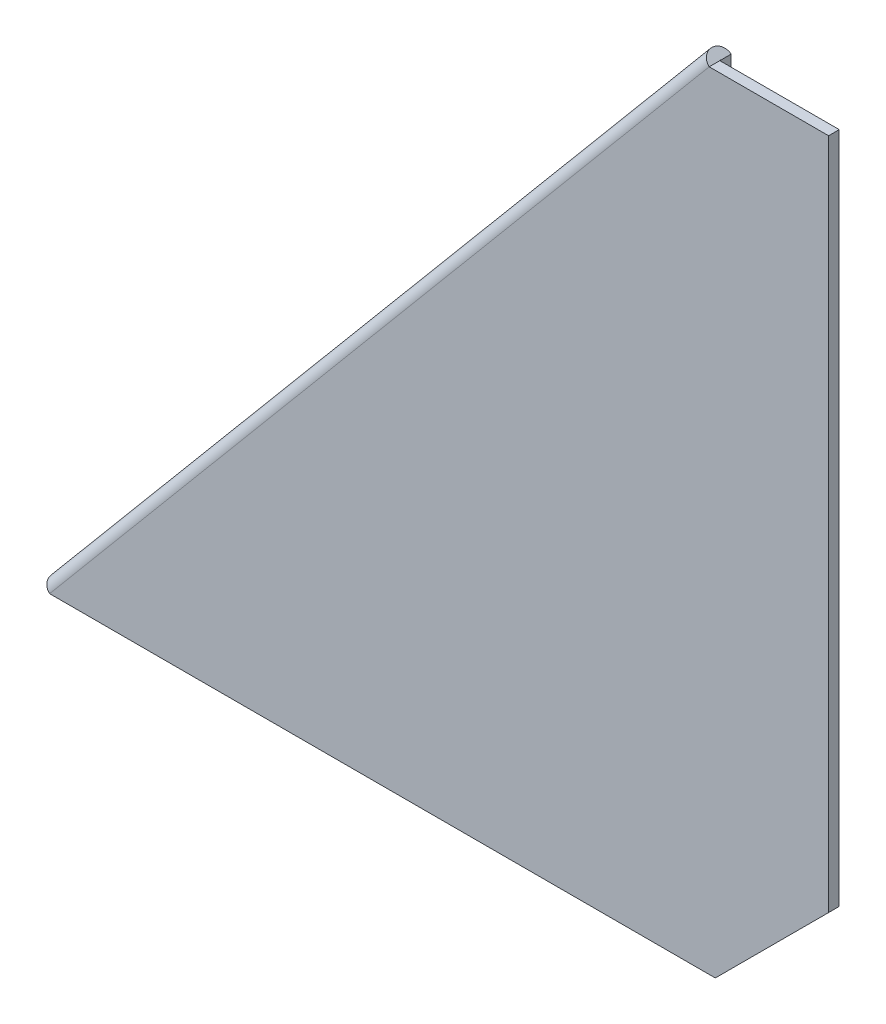
ISO-10303-21;
HEADER;
FILE_DESCRIPTION(('STEP AP214'),'2;1');
FILE_NAME('part.step','',(''),(''),'','','');
FILE_SCHEMA(('AUTOMOTIVE_DESIGN { 1 0 10303 214 1 1 1 1 }'));
ENDSEC;
DATA;
#1=APPLICATION_CONTEXT('core data for automotive mechanical design processes');
#2=APPLICATION_PROTOCOL_DEFINITION('international standard','automotive_design',2000,#1);
#3=PRODUCT_CONTEXT('',#1,'mechanical');
#4=PRODUCT('Part','Part','',(#3));
#5=PRODUCT_RELATED_PRODUCT_CATEGORY('part','',(#4));
#6=PRODUCT_DEFINITION_FORMATION('','',#4);
#7=PRODUCT_DEFINITION_CONTEXT('part definition',#1,'design');
#8=PRODUCT_DEFINITION('design','',#6,#7);
#9=PRODUCT_DEFINITION_SHAPE('','',#8);
#10=(LENGTH_UNIT() NAMED_UNIT(*) SI_UNIT(.MILLI.,.METRE.));
#11=(NAMED_UNIT(*) PLANE_ANGLE_UNIT() SI_UNIT($,.RADIAN.));
#12=(NAMED_UNIT(*) SI_UNIT($,.STERADIAN.) SOLID_ANGLE_UNIT());
#13=UNCERTAINTY_MEASURE_WITH_UNIT(LENGTH_MEASURE(1.E-05),#10,'distance_accuracy_value','');
#14=(GEOMETRIC_REPRESENTATION_CONTEXT(3) GLOBAL_UNCERTAINTY_ASSIGNED_CONTEXT((#13)) GLOBAL_UNIT_ASSIGNED_CONTEXT((#10,
#11,#12)) REPRESENTATION_CONTEXT('',''));
#15=CARTESIAN_POINT('',(0.,0.,0.));
#16=DIRECTION('',(0.,0.,1.));
#17=DIRECTION('',(1.,0.,0.));
#18=AXIS2_PLACEMENT_3D('',#15,#16,#17);
#19=CARTESIAN_POINT('',(0.,0.,1.5));
#20=DIRECTION('',(0.,-1.,0.));
#21=DIRECTION('',(0.,0.,1.));
#22=AXIS2_PLACEMENT_3D('',#19,#20,#21);
#23=PLANE('',#22);
#24=DIRECTION('',(1.,0.,0.));
#25=VECTOR('',#24,1.);
#26=CARTESIAN_POINT('',(0.,0.,1.5));
#27=LINE('',#26,#25);
#28=CARTESIAN_POINT('',(-110.,0.,1.5));
#29=VERTEX_POINT('',#28);
#30=CARTESIAN_POINT('',(-100.274715694475,0.,1.5));
#31=VERTEX_POINT('',#30);
#32=EDGE_CURVE('E180',#29,#31,#27,.T.);
#33=ORIENTED_EDGE('',*,*,#32,.F.);
#34=DIRECTION('',(0.,0.,-1.));
#35=VECTOR('',#34,1.);
#36=CARTESIAN_POINT('',(-110.,0.,1.5));
#37=LINE('',#36,#35);
#38=CARTESIAN_POINT('',(-110.,0.,0.));
#39=VERTEX_POINT('',#38);
#40=EDGE_CURVE('E194',#29,#39,#37,.T.);
#41=ORIENTED_EDGE('',*,*,#40,.T.);
#42=DIRECTION('',(1.,0.,0.));
#43=VECTOR('',#42,1.);
#44=CARTESIAN_POINT('',(0.,0.,0.));
#45=LINE('',#44,#43);
#46=CARTESIAN_POINT('',(-100.274715694475,0.,0.));
#47=VERTEX_POINT('',#46);
#48=EDGE_CURVE('E174',#39,#47,#45,.T.);
#49=ORIENTED_EDGE('',*,*,#48,.T.);
#50=DIRECTION('',(0.,0.,-1.));
#51=VECTOR('',#50,1.);
#52=CARTESIAN_POINT('',(-100.274715694475,0.,1.5));
#53=LINE('',#52,#51);
#54=EDGE_CURVE('E11',#31,#47,#53,.T.);
#55=ORIENTED_EDGE('',*,*,#54,.F.);
#56=EDGE_LOOP('',(#33,#41,#49,#55));
#57=FACE_BOUND('',#56,.T.);
#58=ADVANCED_FACE('F39',(#57),#23,.T.);
#59=CARTESIAN_POINT('',(0.,111.,1.5));
#60=DIRECTION('',(1.,0.,0.));
#61=DIRECTION('',(0.,0.,1.));
#62=AXIS2_PLACEMENT_3D('',#59,#60,#61);
#63=PLANE('',#62);
#64=DIRECTION('',(0.,1.,0.));
#65=VECTOR('',#64,1.);
#66=CARTESIAN_POINT('',(0.,111.,0.));
#67=LINE('',#66,#65);
#68=CARTESIAN_POINT('',(0.,16.0000000000001,0.));
#69=VERTEX_POINT('',#68);
#70=CARTESIAN_POINT('',(0.,111.,0.));
#71=VERTEX_POINT('',#70);
#72=EDGE_CURVE('E169',#69,#71,#67,.T.);
#73=ORIENTED_EDGE('',*,*,#72,.T.);
#74=DIRECTION('',(0.,0.,-1.));
#75=VECTOR('',#74,1.);
#76=CARTESIAN_POINT('',(0.,111.,1.5));
#77=LINE('',#76,#75);
#78=CARTESIAN_POINT('',(0.,111.,1.5));
#79=VERTEX_POINT('',#78);
#80=EDGE_CURVE('E183',#79,#71,#77,.T.);
#81=ORIENTED_EDGE('',*,*,#80,.F.);
#82=DIRECTION('',(0.,1.,0.));
#83=VECTOR('',#82,1.);
#84=CARTESIAN_POINT('',(0.,111.,1.5));
#85=LINE('',#84,#83);
#86=CARTESIAN_POINT('',(0.,16.0000000000001,1.5));
#87=VERTEX_POINT('',#86);
#88=EDGE_CURVE('E170',#87,#79,#85,.T.);
#89=ORIENTED_EDGE('',*,*,#88,.F.);
#90=DIRECTION('',(0.,0.,1.));
#91=VECTOR('',#90,1.);
#92=CARTESIAN_POINT('',(0.,16.0000000000001,1.5));
#93=LINE('',#92,#91);
#94=EDGE_CURVE('E207',#69,#87,#93,.T.);
#95=ORIENTED_EDGE('',*,*,#94,.F.);
#96=EDGE_LOOP('',(#73,#81,#89,#95));
#97=FACE_BOUND('',#96,.T.);
#98=ADVANCED_FACE('F232',(#97),#63,.T.);
#99=ORIENTED_EDGE('',*,*,#54,.T.);
#100=CARTESIAN_POINT('',(-16.0000000000001,0.,0.));
#101=VERTEX_POINT('',#100);
#102=EDGE_CURVE('E61',#47,#101,#45,.T.);
#103=ORIENTED_EDGE('',*,*,#102,.T.);
#104=DIRECTION('',(0.,0.,-1.));
#105=VECTOR('',#104,1.);
#106=CARTESIAN_POINT('',(-16.0000000000001,0.,1.5));
#107=LINE('',#106,#105);
#108=CARTESIAN_POINT('',(-16.0000000000001,0.,1.5));
#109=VERTEX_POINT('',#108);
#110=EDGE_CURVE('E197',#109,#101,#107,.T.);
#111=ORIENTED_EDGE('',*,*,#110,.F.);
#112=EDGE_CURVE('E53',#31,#109,#27,.T.);
#113=ORIENTED_EDGE('',*,*,#112,.F.);
#114=EDGE_LOOP('',(#99,#103,#111,#113));
#115=FACE_BOUND('',#114,.T.);
#116=ADVANCED_FACE('F215',(#115),#23,.T.);
#117=CARTESIAN_POINT('',(-16.8599409393209,111.,1.5));
#118=DIRECTION('',(0.,1.,0.));
#119=DIRECTION('',(0.,0.,-1.));
#120=AXIS2_PLACEMENT_3D('',#117,#118,#119);
#121=PLANE('',#120);
#122=DIRECTION('',(-1.,0.,0.));
#123=VECTOR('',#122,1.);
#124=CARTESIAN_POINT('',(-16.8599409393209,111.,0.));
#125=LINE('',#124,#123);
#126=CARTESIAN_POINT('',(-16.8599409393209,111.,0.));
#127=VERTEX_POINT('',#126);
#128=EDGE_CURVE('E186',#71,#127,#125,.T.);
#129=ORIENTED_EDGE('',*,*,#128,.T.);
#130=DIRECTION('',(0.,0.,-1.));
#131=VECTOR('',#130,1.);
#132=CARTESIAN_POINT('',(-16.8599409393209,111.,1.5));
#133=LINE('',#132,#131);
#134=CARTESIAN_POINT('',(-16.8599409393209,111.,1.5));
#135=VERTEX_POINT('',#134);
#136=EDGE_CURVE('E198',#135,#127,#133,.T.);
#137=ORIENTED_EDGE('',*,*,#136,.F.);
#138=DIRECTION('',(-1.,0.,0.));
#139=VECTOR('',#138,1.);
#140=CARTESIAN_POINT('',(-16.8599409393209,111.,1.5));
#141=LINE('',#140,#139);
#142=EDGE_CURVE('E173',#79,#135,#141,.T.);
#143=ORIENTED_EDGE('',*,*,#142,.F.);
#144=ORIENTED_EDGE('',*,*,#80,.T.);
#145=EDGE_LOOP('',(#129,#137,#143,#144));
#146=FACE_BOUND('',#145,.T.);
#147=ADVANCED_FACE('F229',(#146),#121,.T.);
#148=CARTESIAN_POINT('',(0.,0.,1.5));
#149=DIRECTION('',(0.,0.,1.));
#150=DIRECTION('',(-1.,0.,0.));
#151=AXIS2_PLACEMENT_3D('',#148,#149,#150);
#152=PLANE('',#151);
#153=ORIENTED_EDGE('',*,*,#88,.T.);
#154=ORIENTED_EDGE('',*,*,#142,.T.);
#155=DIRECTION('',(-0.642787609686543,-0.766044443118975,0.));
#156=VECTOR('',#155,1.);
#157=CARTESIAN_POINT('',(-110.,0.,1.5));
#158=LINE('',#157,#156);
#159=EDGE_CURVE('E177',#135,#29,#158,.T.);
#160=ORIENTED_EDGE('',*,*,#159,.T.);
#161=ORIENTED_EDGE('',*,*,#32,.T.);
#162=ORIENTED_EDGE('',*,*,#112,.T.);
#163=DIRECTION('',(0.707106781186548,0.707106781186548,0.));
#164=VECTOR('',#163,1.);
#165=CARTESIAN_POINT('',(-8.00000000000006,8.00000000000006,1.5));
#166=LINE('',#165,#164);
#167=EDGE_CURVE('E47',#87,#109,#166,.F.);
#168=ORIENTED_EDGE('',*,*,#167,.F.);
#169=EDGE_LOOP('',(#153,#154,#160,#161,#162,#168));
#170=FACE_BOUND('',#169,.T.);
#171=ADVANCED_FACE('F213',(#170),#152,.T.);
#172=CARTESIAN_POINT('',(0.,0.,0.));
#173=DIRECTION('',(0.,0.,1.));
#174=DIRECTION('',(-1.,0.,0.));
#175=AXIS2_PLACEMENT_3D('',#172,#173,#174);
#176=PLANE('',#175);
#177=ORIENTED_EDGE('',*,*,#48,.F.);
#178=DIRECTION('',(-0.642787609686543,-0.766044443118975,0.));
#179=VECTOR('',#178,1.);
#180=CARTESIAN_POINT('',(-110.,0.,0.));
#181=LINE('',#180,#179);
#182=EDGE_CURVE('E189',#127,#39,#181,.T.);
#183=ORIENTED_EDGE('',*,*,#182,.F.);
#184=ORIENTED_EDGE('',*,*,#128,.F.);
#185=ORIENTED_EDGE('',*,*,#72,.F.);
#186=DIRECTION('',(-0.707106781186548,-0.707106781186548,0.));
#187=VECTOR('',#186,1.);
#188=CARTESIAN_POINT('',(-16.0000000000001,0.,0.));
#189=LINE('',#188,#187);
#190=EDGE_CURVE('E205',#101,#69,#189,.F.);
#191=ORIENTED_EDGE('',*,*,#190,.F.);
#192=ORIENTED_EDGE('',*,*,#102,.F.);
#193=EDGE_LOOP('',(#177,#183,#184,#185,#191,#192));
#194=FACE_BOUND('',#193,.T.);
#195=ADVANCED_FACE('F219',(#194),#176,.F.);
#196=CARTESIAN_POINT('',(-16.0000000000001,0.,1.5));
#197=DIRECTION('',(-0.707106781186547,0.707106781186547,0.));
#198=DIRECTION('',(0.,0.,-1.));
#199=AXIS2_PLACEMENT_3D('',#196,#197,#198);
#200=PLANE('',#199);
#201=ORIENTED_EDGE('',*,*,#167,.T.);
#202=ORIENTED_EDGE('',*,*,#110,.T.);
#203=ORIENTED_EDGE('',*,*,#190,.T.);
#204=ORIENTED_EDGE('',*,*,#94,.T.);
#205=EDGE_LOOP('',(#201,#202,#203,#204));
#206=FACE_BOUND('',#205,.T.);
#207=ADVANCED_FACE('F41',(#206),#200,.F.);
#208=CARTESIAN_POINT('',(-57.7229393684241,50.7112323078353,-1.6));
#209=DIRECTION('',(-0.766044443118975,0.642787609686543,0.));
#210=DIRECTION('',(-0.642787609686543,-0.766044443118975,0.));
#211=AXIS2_PLACEMENT_3D('',#208,#209,#210);
#212=PLANE('',#211);
#213=DIRECTION('',(0.,0.,-1.));
#214=VECTOR('',#213,1.);
#215=CARTESIAN_POINT('',(-100.274715694475,0.,1.5));
#216=LINE('',#215,#214);
#217=CARTESIAN_POINT('',(-100.274715694475,0.,-0.1));
#218=VERTEX_POINT('',#217);
#219=CARTESIAN_POINT('',(-100.274715694475,0.,-1.6));
#220=VERTEX_POINT('',#219);
#221=EDGE_CURVE('E122',#218,#220,#216,.T.);
#222=ORIENTED_EDGE('',*,*,#221,.T.);
#223=DIRECTION('',(-0.642787609686543,-0.766044443118975,0.));
#224=VECTOR('',#223,1.);
#225=CARTESIAN_POINT('',(-57.7229393684241,50.7112323078353,-1.6));
#226=LINE('',#225,#224);
#227=CARTESIAN_POINT('',(-16.8599409393209,99.40985748989,-1.6));
#228=VERTEX_POINT('',#227);
#229=EDGE_CURVE('E129',#228,#220,#226,.T.);
#230=ORIENTED_EDGE('',*,*,#229,.F.);
#231=DIRECTION('',(0.,0.,-1.));
#232=VECTOR('',#231,1.);
#233=CARTESIAN_POINT('',(-16.8599409393209,99.40985748989,1.501));
#234=LINE('',#233,#232);
#235=CARTESIAN_POINT('',(-16.8599409393209,99.40985748989,-0.0999999999999996));
#236=VERTEX_POINT('',#235);
#237=EDGE_CURVE('E148',#236,#228,#234,.T.);
#238=ORIENTED_EDGE('',*,*,#237,.F.);
#239=DIRECTION('',(-0.642787609686543,-0.766044443118975,0.));
#240=VECTOR('',#239,1.);
#241=CARTESIAN_POINT('',(-57.7229393684241,50.7112323078353,-0.1));
#242=LINE('',#241,#240);
#243=EDGE_CURVE('E141',#236,#218,#242,.T.);
#244=ORIENTED_EDGE('',*,*,#243,.T.);
#245=EDGE_LOOP('',(#222,#230,#238,#244));
#246=FACE_BOUND('',#245,.T.);
#247=ADVANCED_FACE('F139',(#246),#212,.F.);
#248=CARTESIAN_POINT('',(-60.5764549190423,53.1056161539176,-1.6));
#249=DIRECTION('',(0.,0.,-1.));
#250=DIRECTION('',(1.,0.,0.));
#251=AXIS2_PLACEMENT_3D('',#248,#249,#250);
#252=PLANE('',#251);
#253=DIRECTION('',(-1.,0.,0.));
#254=VECTOR('',#253,1.);
#255=CARTESIAN_POINT('',(-110.,0.,-1.6));
#256=LINE('',#255,#254);
#257=CARTESIAN_POINT('',(-110.,0.,-1.6));
#258=VERTEX_POINT('',#257);
#259=EDGE_CURVE('E117',#220,#258,#256,.T.);
#260=ORIENTED_EDGE('',*,*,#259,.T.);
#261=DIRECTION('',(0.642787609686543,0.766044443118975,0.));
#262=VECTOR('',#261,1.);
#263=CARTESIAN_POINT('',(-63.4299704696605,55.5,-1.6));
#264=LINE('',#263,#262);
#265=CARTESIAN_POINT('',(-16.8599409393209,111.,-1.6));
#266=VERTEX_POINT('',#265);
#267=EDGE_CURVE('E136',#258,#266,#264,.T.);
#268=ORIENTED_EDGE('',*,*,#267,.T.);
#269=DIRECTION('',(0.,-1.,0.));
#270=VECTOR('',#269,1.);
#271=CARTESIAN_POINT('',(-16.8599409393209,111.,-1.6));
#272=LINE('',#271,#270);
#273=EDGE_CURVE('E132',#266,#228,#272,.T.);
#274=ORIENTED_EDGE('',*,*,#273,.T.);
#275=ORIENTED_EDGE('',*,*,#229,.T.);
#276=EDGE_LOOP('',(#260,#268,#274,#275));
#277=FACE_BOUND('',#276,.T.);
#278=ADVANCED_FACE('F130',(#277),#252,.T.);
#279=CARTESIAN_POINT('',(-60.5764549190423,53.1056161539176,-0.1));
#280=DIRECTION('',(0.,0.,-1.));
#281=DIRECTION('',(1.,0.,0.));
#282=AXIS2_PLACEMENT_3D('',#279,#280,#281);
#283=PLANE('',#282);
#284=ORIENTED_EDGE('',*,*,#243,.F.);
#285=DIRECTION('',(0.,1.,0.));
#286=VECTOR('',#285,1.);
#287=CARTESIAN_POINT('',(-16.8599409393209,111.,-0.1));
#288=LINE('',#287,#286);
#289=CARTESIAN_POINT('',(-16.8599409393209,111.,-0.1));
#290=VERTEX_POINT('',#289);
#291=EDGE_CURVE('E144',#236,#290,#288,.T.);
#292=ORIENTED_EDGE('',*,*,#291,.T.);
#293=DIRECTION('',(0.642787609686543,0.766044443118975,0.));
#294=VECTOR('',#293,1.);
#295=CARTESIAN_POINT('',(-63.4299704696605,55.5,-0.1));
#296=LINE('',#295,#294);
#297=CARTESIAN_POINT('',(-110.,0.,-0.1));
#298=VERTEX_POINT('',#297);
#299=EDGE_CURVE('E155',#298,#290,#296,.T.);
#300=ORIENTED_EDGE('',*,*,#299,.F.);
#301=DIRECTION('',(-1.,0.,0.));
#302=VECTOR('',#301,1.);
#303=CARTESIAN_POINT('',(-60.5764549190423,0.,-0.1));
#304=LINE('',#303,#302);
#305=EDGE_CURVE('E142',#218,#298,#304,.T.);
#306=ORIENTED_EDGE('',*,*,#305,.F.);
#307=EDGE_LOOP('',(#284,#292,#300,#306));
#308=FACE_BOUND('',#307,.T.);
#309=ADVANCED_FACE('F240',(#308),#283,.F.);
#310=CARTESIAN_POINT('',(-16.8599409393209,111.,-0.05));
#311=DIRECTION('',(0.642787609686543,0.766044443118975,0.));
#312=DIRECTION('',(-0.766044443118975,0.642787609686543,0.));
#313=AXIS2_PLACEMENT_3D('',#310,#311,#312);
#314=PLANE('',#313);
#315=DIRECTION('',(0.,0.,-1.));
#316=VECTOR('',#315,1.);
#317=CARTESIAN_POINT('',(-16.8599409393209,111.,-1.6));
#318=LINE('',#317,#316);
#319=EDGE_CURVE('E166',#290,#266,#318,.T.);
#320=ORIENTED_EDGE('',*,*,#319,.T.);
#321=CARTESIAN_POINT('',(-16.8599409393209,111.,-0.05));
#322=DIRECTION('',(0.642787609686543,0.766044443118975,0.));
#323=DIRECTION('',(0.766044443118975,-0.642787609686543,0.));
#324=AXIS2_PLACEMENT_3D('',#321,#322,#323);
#325=CIRCLE('',#324,1.55);
#326=EDGE_CURVE('E153',#135,#266,#325,.F.);
#327=ORIENTED_EDGE('',*,*,#326,.F.);
#328=ORIENTED_EDGE('',*,*,#136,.T.);
#329=CARTESIAN_POINT('',(-16.8599409393209,111.,-0.05));
#330=DIRECTION('',(0.642787609686543,0.766044443118975,0.));
#331=DIRECTION('',(0.766044443118975,-0.642787609686543,0.));
#332=AXIS2_PLACEMENT_3D('',#329,#330,#331);
#333=CIRCLE('',#332,0.05);
#334=EDGE_CURVE('E158',#127,#290,#333,.F.);
#335=ORIENTED_EDGE('',*,*,#334,.T.);
#336=EDGE_LOOP('',(#320,#327,#328,#335));
#337=FACE_BOUND('',#336,.T.);
#338=ADVANCED_FACE('F225',(#337),#314,.T.);
#339=CARTESIAN_POINT('',(-110.,0.,-0.05));
#340=DIRECTION('',(0.642787609686543,0.766044443118975,0.));
#341=DIRECTION('',(-0.766044443118975,0.642787609686543,0.));
#342=AXIS2_PLACEMENT_3D('',#339,#340,#341);
#343=PLANE('',#342);
#344=CARTESIAN_POINT('',(-110.,0.,-0.05));
#345=DIRECTION('',(0.642787609686543,0.766044443118975,0.));
#346=DIRECTION('',(0.766044443118975,-0.642787609686543,0.));
#347=AXIS2_PLACEMENT_3D('',#344,#345,#346);
#348=CIRCLE('',#347,0.05);
#349=EDGE_CURVE('E152',#298,#39,#348,.T.);
#350=ORIENTED_EDGE('',*,*,#349,.T.);
#351=ORIENTED_EDGE('',*,*,#40,.F.);
#352=CARTESIAN_POINT('',(-110.,0.,-0.05));
#353=DIRECTION('',(0.642787609686543,0.766044443118975,0.));
#354=DIRECTION('',(0.766044443118975,-0.642787609686543,0.));
#355=AXIS2_PLACEMENT_3D('',#352,#353,#354);
#356=CIRCLE('',#355,1.55);
#357=EDGE_CURVE('E156',#258,#29,#356,.T.);
#358=ORIENTED_EDGE('',*,*,#357,.F.);
#359=DIRECTION('',(0.,0.,-1.));
#360=VECTOR('',#359,1.);
#361=CARTESIAN_POINT('',(-110.,0.,-1.6));
#362=LINE('',#361,#360);
#363=EDGE_CURVE('E123',#298,#258,#362,.T.);
#364=ORIENTED_EDGE('',*,*,#363,.F.);
#365=EDGE_LOOP('',(#350,#351,#358,#364));
#366=FACE_BOUND('',#365,.T.);
#367=ADVANCED_FACE('F235',(#366),#343,.F.);
#368=CARTESIAN_POINT('',(-110.,0.,-0.05));
#369=DIRECTION('',(-0.642787609686543,-0.766044443118975,0.));
#370=DIRECTION('',(0.,0.,-1.));
#371=AXIS2_PLACEMENT_3D('',#368,#369,#370);
#372=CYLINDRICAL_SURFACE('',#371,1.55);
#373=ORIENTED_EDGE('',*,*,#159,.F.);
#374=ORIENTED_EDGE('',*,*,#326,.T.);
#375=ORIENTED_EDGE('',*,*,#267,.F.);
#376=ORIENTED_EDGE('',*,*,#357,.T.);
#377=EDGE_LOOP('',(#373,#374,#375,#376));
#378=FACE_BOUND('',#377,.T.);
#379=ADVANCED_FACE('F243',(#378),#372,.T.);
#380=CARTESIAN_POINT('',(-110.,0.,-0.05));
#381=DIRECTION('',(-0.642787609686543,-0.766044443118975,0.));
#382=DIRECTION('',(0.,0.,-1.));
#383=AXIS2_PLACEMENT_3D('',#380,#381,#382);
#384=CYLINDRICAL_SURFACE('',#383,0.05);
#385=ORIENTED_EDGE('',*,*,#182,.T.);
#386=ORIENTED_EDGE('',*,*,#349,.F.);
#387=ORIENTED_EDGE('',*,*,#299,.T.);
#388=ORIENTED_EDGE('',*,*,#334,.F.);
#389=EDGE_LOOP('',(#385,#386,#387,#388));
#390=FACE_BOUND('',#389,.T.);
#391=ADVANCED_FACE('F237',(#390),#384,.F.);
#392=CARTESIAN_POINT('',(-16.8599409393209,111.,1.501));
#393=DIRECTION('',(-1.,0.,0.));
#394=DIRECTION('',(0.,0.,-1.));
#395=AXIS2_PLACEMENT_3D('',#392,#393,#394);
#396=PLANE('',#395);
#397=ORIENTED_EDGE('',*,*,#291,.F.);
#398=ORIENTED_EDGE('',*,*,#237,.T.);
#399=ORIENTED_EDGE('',*,*,#273,.F.);
#400=ORIENTED_EDGE('',*,*,#319,.F.);
#401=EDGE_LOOP('',(#397,#398,#399,#400));
#402=FACE_BOUND('',#401,.T.);
#403=ADVANCED_FACE('F242',(#402),#396,.F.);
#404=CARTESIAN_POINT('',(-110.,0.,1.5));
#405=DIRECTION('',(0.,1.,0.));
#406=DIRECTION('',(-1.,0.,0.));
#407=AXIS2_PLACEMENT_3D('',#404,#405,#406);
#408=PLANE('',#407);
#409=ORIENTED_EDGE('',*,*,#221,.F.);
#410=ORIENTED_EDGE('',*,*,#305,.T.);
#411=ORIENTED_EDGE('',*,*,#363,.T.);
#412=ORIENTED_EDGE('',*,*,#259,.F.);
#413=EDGE_LOOP('',(#409,#410,#411,#412));
#414=FACE_BOUND('',#413,.T.);
#415=ADVANCED_FACE('F119',(#414),#408,.F.);
#416=CLOSED_SHELL('',(#58,#98,#116,#147,#171,#195,#207,#247,#278,#309,#338,#367,#379,#391,#403,#415));
#417=MANIFOLD_SOLID_BREP('B2',#416);
#418=ADVANCED_BREP_SHAPE_REPRESENTATION('',(#18,#417),#14);
#419=SHAPE_DEFINITION_REPRESENTATION(#9,#418);
ENDSEC;
END-ISO-10303-21;
